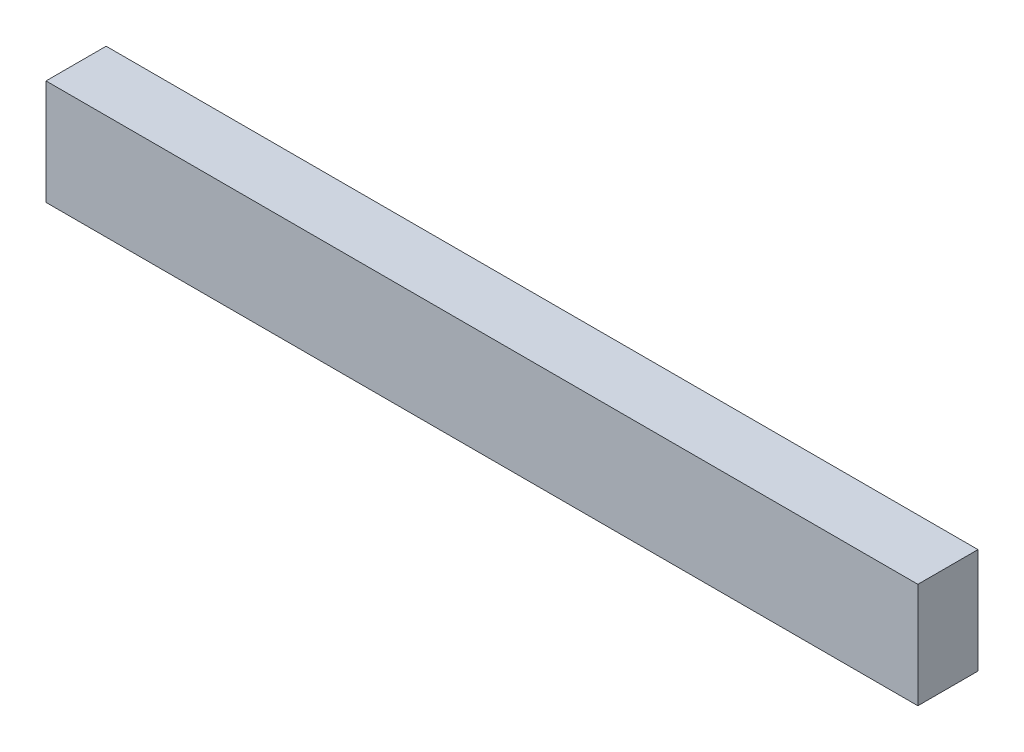
ISO-10303-21;
HEADER;
FILE_DESCRIPTION(('STEP AP214'),'2;1');
FILE_NAME('part.step','',(''),(''),'','','');
FILE_SCHEMA(('AUTOMOTIVE_DESIGN { 1 0 10303 214 1 1 1 1 }'));
ENDSEC;
DATA;
#1=APPLICATION_CONTEXT('core data for automotive mechanical design processes');
#2=APPLICATION_PROTOCOL_DEFINITION('international standard','automotive_design',2000,#1);
#3=PRODUCT_CONTEXT('',#1,'mechanical');
#4=PRODUCT('Part','Part','',(#3));
#5=PRODUCT_RELATED_PRODUCT_CATEGORY('part','',(#4));
#6=PRODUCT_DEFINITION_FORMATION('','',#4);
#7=PRODUCT_DEFINITION_CONTEXT('part definition',#1,'design');
#8=PRODUCT_DEFINITION('design','',#6,#7);
#9=PRODUCT_DEFINITION_SHAPE('','',#8);
#10=(LENGTH_UNIT() NAMED_UNIT(*) SI_UNIT(.MILLI.,.METRE.));
#11=(NAMED_UNIT(*) PLANE_ANGLE_UNIT() SI_UNIT($,.RADIAN.));
#12=(NAMED_UNIT(*) SI_UNIT($,.STERADIAN.) SOLID_ANGLE_UNIT());
#13=UNCERTAINTY_MEASURE_WITH_UNIT(LENGTH_MEASURE(1.E-05),#10,'distance_accuracy_value','');
#14=(GEOMETRIC_REPRESENTATION_CONTEXT(3) GLOBAL_UNCERTAINTY_ASSIGNED_CONTEXT((#13)) GLOBAL_UNIT_ASSIGNED_CONTEXT((#10,
#11,#12)) REPRESENTATION_CONTEXT('',''));
#15=CARTESIAN_POINT('',(0.,0.,0.));
#16=DIRECTION('',(0.,0.,1.));
#17=DIRECTION('',(1.,0.,0.));
#18=AXIS2_PLACEMENT_3D('',#15,#16,#17);
#19=CARTESIAN_POINT('',(-82.,8.5,-4.73559965478057));
#20=DIRECTION('',(-1.,0.,0.));
#21=DIRECTION('',(0.,0.,1.));
#22=AXIS2_PLACEMENT_3D('',#19,#20,#21);
#23=PLANE('',#22);
#24=DIRECTION('',(0.,0.,-1.));
#25=VECTOR('',#24,1.);
#26=CARTESIAN_POINT('',(-82.,1.5,-4.73559965478057));
#27=LINE('',#26,#25);
#28=CARTESIAN_POINT('',(-82.,1.5,-0.735599654780569));
#29=VERTEX_POINT('',#28);
#30=CARTESIAN_POINT('',(-82.,1.5,-4.73559965478057));
#31=VERTEX_POINT('',#30);
#32=EDGE_CURVE('E99',#29,#31,#27,.T.);
#33=ORIENTED_EDGE('',*,*,#32,.T.);
#34=DIRECTION('',(0.,-1.,0.));
#35=VECTOR('',#34,1.);
#36=CARTESIAN_POINT('',(-82.,8.5,-4.73559965478057));
#37=LINE('',#36,#35);
#38=CARTESIAN_POINT('',(-82.,8.5,-4.73559965478057));
#39=VERTEX_POINT('',#38);
#40=EDGE_CURVE('E97',#39,#31,#37,.T.);
#41=ORIENTED_EDGE('',*,*,#40,.F.);
#42=DIRECTION('',(0.,0.,-1.));
#43=VECTOR('',#42,1.);
#44=CARTESIAN_POINT('',(-82.,8.5,-4.73559965478057));
#45=LINE('',#44,#43);
#46=CARTESIAN_POINT('',(-82.,8.5,-0.735599654780569));
#47=VERTEX_POINT('',#46);
#48=EDGE_CURVE('E104',#47,#39,#45,.T.);
#49=ORIENTED_EDGE('',*,*,#48,.F.);
#50=DIRECTION('',(0.,-1.,0.));
#51=VECTOR('',#50,1.);
#52=CARTESIAN_POINT('',(-82.,8.5,-0.735599654780569));
#53=LINE('',#52,#51);
#54=EDGE_CURVE('E102',#47,#29,#53,.T.);
#55=ORIENTED_EDGE('',*,*,#54,.T.);
#56=EDGE_LOOP('',(#33,#41,#49,#55));
#57=FACE_BOUND('',#56,.T.);
#58=ADVANCED_FACE('F45',(#57),#23,.F.);
#59=CARTESIAN_POINT('',(-140.,8.5,-4.73559965478057));
#60=DIRECTION('',(0.,0.,1.));
#61=DIRECTION('',(1.,0.,0.));
#62=AXIS2_PLACEMENT_3D('',#59,#60,#61);
#63=PLANE('',#62);
#64=DIRECTION('',(-1.,0.,0.));
#65=VECTOR('',#64,1.);
#66=CARTESIAN_POINT('',(-140.,1.5,-4.73559965478057));
#67=LINE('',#66,#65);
#68=CARTESIAN_POINT('',(-140.,1.5,-4.73559965478057));
#69=VERTEX_POINT('',#68);
#70=EDGE_CURVE('E83',#31,#69,#67,.T.);
#71=ORIENTED_EDGE('',*,*,#70,.T.);
#72=DIRECTION('',(0.,-1.,0.));
#73=VECTOR('',#72,1.);
#74=CARTESIAN_POINT('',(-140.,8.5,-4.73559965478057));
#75=LINE('',#74,#73);
#76=CARTESIAN_POINT('',(-140.,8.5,-4.73559965478057));
#77=VERTEX_POINT('',#76);
#78=EDGE_CURVE('E94',#77,#69,#75,.T.);
#79=ORIENTED_EDGE('',*,*,#78,.F.);
#80=DIRECTION('',(-1.,0.,0.));
#81=VECTOR('',#80,1.);
#82=CARTESIAN_POINT('',(-140.,8.5,-4.73559965478057));
#83=LINE('',#82,#81);
#84=EDGE_CURVE('E61',#39,#77,#83,.T.);
#85=ORIENTED_EDGE('',*,*,#84,.F.);
#86=ORIENTED_EDGE('',*,*,#40,.T.);
#87=EDGE_LOOP('',(#71,#79,#85,#86));
#88=FACE_BOUND('',#87,.T.);
#89=ADVANCED_FACE('F93',(#88),#63,.F.);
#90=CARTESIAN_POINT('',(0.,8.5,0.));
#91=DIRECTION('',(0.,1.,0.));
#92=DIRECTION('',(0.,0.,1.));
#93=AXIS2_PLACEMENT_3D('',#90,#91,#92);
#94=PLANE('',#93);
#95=DIRECTION('',(0.,0.,1.));
#96=VECTOR('',#95,1.);
#97=CARTESIAN_POINT('',(-140.,8.5,-4.73559965478057));
#98=LINE('',#97,#96);
#99=CARTESIAN_POINT('',(-140.,8.5,-0.735599654780569));
#100=VERTEX_POINT('',#99);
#101=EDGE_CURVE('E98',#77,#100,#98,.T.);
#102=ORIENTED_EDGE('',*,*,#101,.T.);
#103=DIRECTION('',(1.,0.,0.));
#104=VECTOR('',#103,1.);
#105=CARTESIAN_POINT('',(-140.,8.5,-0.735599654780569));
#106=LINE('',#105,#104);
#107=EDGE_CURVE('E112',#100,#47,#106,.T.);
#108=ORIENTED_EDGE('',*,*,#107,.T.);
#109=ORIENTED_EDGE('',*,*,#48,.T.);
#110=ORIENTED_EDGE('',*,*,#84,.T.);
#111=EDGE_LOOP('',(#102,#108,#109,#110));
#112=FACE_BOUND('',#111,.T.);
#113=ADVANCED_FACE('F115',(#112),#94,.T.);
#114=CARTESIAN_POINT('',(-140.,8.5,-0.735599654780569));
#115=DIRECTION('',(0.,0.,-1.));
#116=DIRECTION('',(-1.,0.,0.));
#117=AXIS2_PLACEMENT_3D('',#114,#115,#116);
#118=PLANE('',#117);
#119=DIRECTION('',(1.,0.,0.));
#120=VECTOR('',#119,1.);
#121=CARTESIAN_POINT('',(-140.,1.5,-0.735599654780569));
#122=LINE('',#121,#120);
#123=CARTESIAN_POINT('',(-140.,1.5,-0.735599654780569));
#124=VERTEX_POINT('',#123);
#125=EDGE_CURVE('E86',#124,#29,#122,.T.);
#126=ORIENTED_EDGE('',*,*,#125,.T.);
#127=ORIENTED_EDGE('',*,*,#54,.F.);
#128=ORIENTED_EDGE('',*,*,#107,.F.);
#129=DIRECTION('',(0.,-1.,0.));
#130=VECTOR('',#129,1.);
#131=CARTESIAN_POINT('',(-140.,8.5,-0.735599654780569));
#132=LINE('',#131,#130);
#133=EDGE_CURVE('E54',#100,#124,#132,.T.);
#134=ORIENTED_EDGE('',*,*,#133,.T.);
#135=EDGE_LOOP('',(#126,#127,#128,#134));
#136=FACE_BOUND('',#135,.T.);
#137=ADVANCED_FACE('F110',(#136),#118,.F.);
#138=CARTESIAN_POINT('',(-140.,1.5,140.));
#139=DIRECTION('',(1.,0.,0.));
#140=DIRECTION('',(0.,0.,-1.));
#141=AXIS2_PLACEMENT_3D('',#138,#139,#140);
#142=PLANE('',#141);
#143=ORIENTED_EDGE('',*,*,#78,.T.);
#144=DIRECTION('',(0.,0.,1.));
#145=VECTOR('',#144,1.);
#146=CARTESIAN_POINT('',(-140.,1.5,140.));
#147=LINE('',#146,#145);
#148=EDGE_CURVE('E11',#69,#124,#147,.T.);
#149=ORIENTED_EDGE('',*,*,#148,.T.);
#150=ORIENTED_EDGE('',*,*,#133,.F.);
#151=ORIENTED_EDGE('',*,*,#101,.F.);
#152=EDGE_LOOP('',(#143,#149,#150,#151));
#153=FACE_BOUND('',#152,.T.);
#154=ADVANCED_FACE('F47',(#153),#142,.F.);
#155=CARTESIAN_POINT('',(-80.2273306678771,1.5,-67.6477865944446));
#156=DIRECTION('',(0.,1.,0.));
#157=DIRECTION('',(0.,0.,1.));
#158=AXIS2_PLACEMENT_3D('',#155,#156,#157);
#159=PLANE('',#158);
#160=ORIENTED_EDGE('',*,*,#32,.F.);
#161=ORIENTED_EDGE('',*,*,#125,.F.);
#162=ORIENTED_EDGE('',*,*,#148,.F.);
#163=ORIENTED_EDGE('',*,*,#70,.F.);
#164=EDGE_LOOP('',(#160,#161,#162,#163));
#165=FACE_BOUND('',#164,.T.);
#166=ADVANCED_FACE('F82',(#165),#159,.F.);
#167=CLOSED_SHELL('',(#58,#89,#113,#137,#154,#166));
#168=MANIFOLD_SOLID_BREP('B2',#167);
#169=ADVANCED_BREP_SHAPE_REPRESENTATION('',(#18,#168),#14);
#170=SHAPE_DEFINITION_REPRESENTATION(#9,#169);
ENDSEC;
END-ISO-10303-21;
